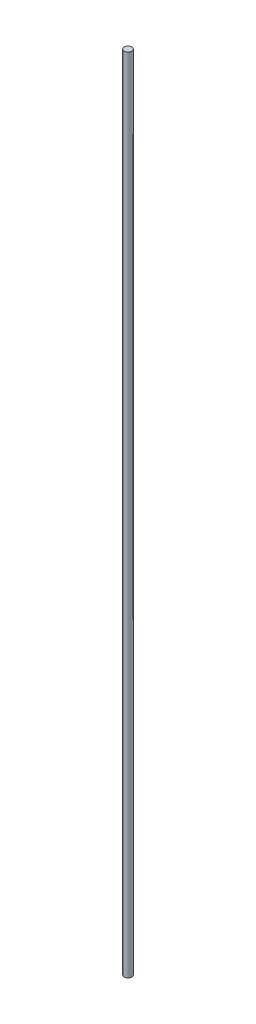
ISO-10303-21;
HEADER;
FILE_DESCRIPTION(('STEP AP214'),'2;1');
FILE_NAME('part.step','',(''),(''),'','','');
FILE_SCHEMA(('AUTOMOTIVE_DESIGN { 1 0 10303 214 1 1 1 1 }'));
ENDSEC;
DATA;
#1=APPLICATION_CONTEXT('core data for automotive mechanical design processes');
#2=APPLICATION_PROTOCOL_DEFINITION('international standard','automotive_design',2000,#1);
#3=PRODUCT_CONTEXT('',#1,'mechanical');
#4=PRODUCT('Part','Part','',(#3));
#5=PRODUCT_RELATED_PRODUCT_CATEGORY('part','',(#4));
#6=PRODUCT_DEFINITION_FORMATION('','',#4);
#7=PRODUCT_DEFINITION_CONTEXT('part definition',#1,'design');
#8=PRODUCT_DEFINITION('design','',#6,#7);
#9=PRODUCT_DEFINITION_SHAPE('','',#8);
#10=(LENGTH_UNIT() NAMED_UNIT(*) SI_UNIT(.MILLI.,.METRE.));
#11=(NAMED_UNIT(*) PLANE_ANGLE_UNIT() SI_UNIT($,.RADIAN.));
#12=(NAMED_UNIT(*) SI_UNIT($,.STERADIAN.) SOLID_ANGLE_UNIT());
#13=UNCERTAINTY_MEASURE_WITH_UNIT(LENGTH_MEASURE(1.E-05),#10,'distance_accuracy_value','');
#14=(GEOMETRIC_REPRESENTATION_CONTEXT(3) GLOBAL_UNCERTAINTY_ASSIGNED_CONTEXT((#13)) GLOBAL_UNIT_ASSIGNED_CONTEXT((#10,
#11,#12)) REPRESENTATION_CONTEXT('',''));
#15=CARTESIAN_POINT('',(0.,0.,0.));
#16=DIRECTION('',(0.,0.,1.));
#17=DIRECTION('',(1.,0.,0.));
#18=AXIS2_PLACEMENT_3D('',#15,#16,#17);
#19=CARTESIAN_POINT('',(0.,1016.,0.));
#20=DIRECTION('',(0.,-1.,0.));
#21=DIRECTION('',(0.,0.,-1.));
#22=AXIS2_PLACEMENT_3D('',#19,#20,#21);
#23=CYLINDRICAL_SURFACE('',#22,4.7625);
#24=CARTESIAN_POINT('',(0.,1016.,0.));
#25=DIRECTION('',(0.,1.,0.));
#26=DIRECTION('',(0.,0.,1.));
#27=AXIS2_PLACEMENT_3D('',#24,#25,#26);
#28=CIRCLE('',#27,4.7625);
#29=CARTESIAN_POINT('',(0.,1016.,4.7625));
#30=VERTEX_POINT('',#29);
#31=EDGE_CURVE('E10',#30,#30,#28,.T.);
#32=ORIENTED_EDGE('',*,*,#31,.F.);
#33=EDGE_LOOP('',(#32));
#34=FACE_BOUND('',#33,.T.);
#35=CARTESIAN_POINT('',(0.,0.,0.));
#36=DIRECTION('',(0.,1.,0.));
#37=DIRECTION('',(0.,0.,1.));
#38=AXIS2_PLACEMENT_3D('',#35,#36,#37);
#39=CIRCLE('',#38,4.7625);
#40=CARTESIAN_POINT('',(0.,0.,4.7625));
#41=VERTEX_POINT('',#40);
#42=EDGE_CURVE('E34',#41,#41,#39,.T.);
#43=ORIENTED_EDGE('',*,*,#42,.T.);
#44=EDGE_LOOP('',(#43));
#45=FACE_BOUND('',#44,.T.);
#46=ADVANCED_FACE('F31',(#34,#45),#23,.T.);
#47=CARTESIAN_POINT('',(0.,1016.,0.));
#48=DIRECTION('',(0.,1.,0.));
#49=DIRECTION('',(0.,0.,1.));
#50=AXIS2_PLACEMENT_3D('',#47,#48,#49);
#51=PLANE('',#50);
#52=ORIENTED_EDGE('',*,*,#31,.T.);
#53=EDGE_LOOP('',(#52));
#54=FACE_BOUND('',#53,.T.);
#55=ADVANCED_FACE('F46',(#54),#51,.T.);
#56=CARTESIAN_POINT('',(0.,0.,0.));
#57=DIRECTION('',(0.,1.,0.));
#58=DIRECTION('',(0.,0.,1.));
#59=AXIS2_PLACEMENT_3D('',#56,#57,#58);
#60=PLANE('',#59);
#61=ORIENTED_EDGE('',*,*,#42,.F.);
#62=EDGE_LOOP('',(#61));
#63=FACE_BOUND('',#62,.T.);
#64=ADVANCED_FACE('F44',(#63),#60,.F.);
#65=CLOSED_SHELL('',(#46,#55,#64));
#66=MANIFOLD_SOLID_BREP('B2',#65);
#67=ADVANCED_BREP_SHAPE_REPRESENTATION('',(#18,#66),#14);
#68=SHAPE_DEFINITION_REPRESENTATION(#9,#67);
ENDSEC;
END-ISO-10303-21;
